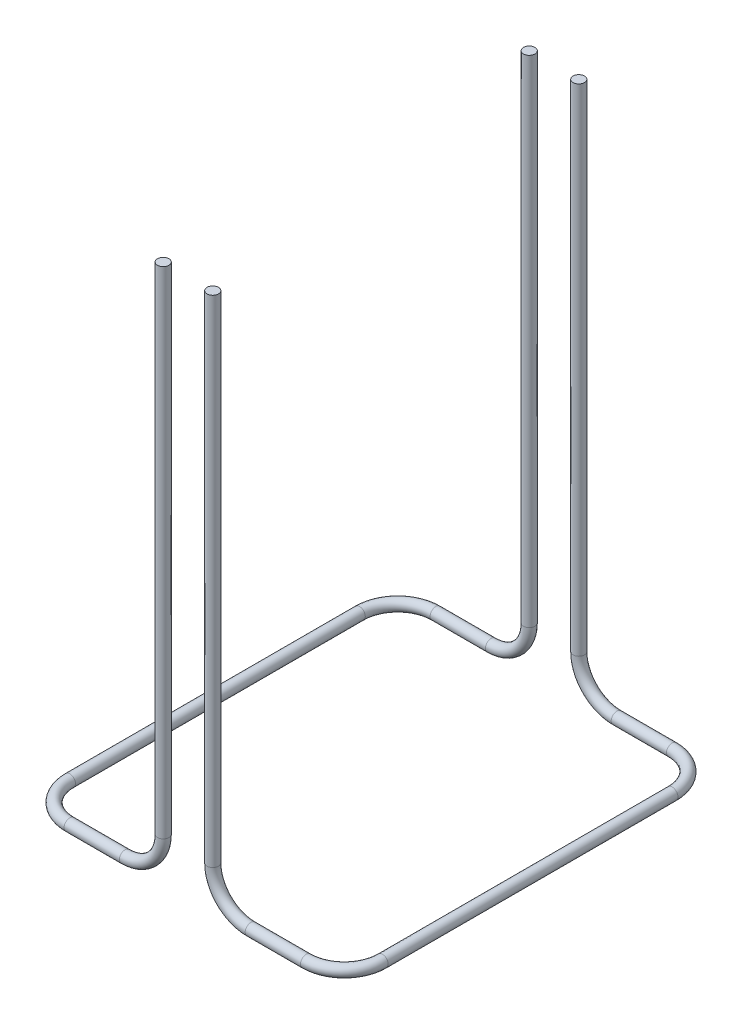
ISO-10303-21;
HEADER;
FILE_DESCRIPTION(('STEP AP214'),'2;1');
FILE_NAME('part.step','',(''),(''),'','','');
FILE_SCHEMA(('AUTOMOTIVE_DESIGN { 1 0 10303 214 1 1 1 1 }'));
ENDSEC;
DATA;
#1=APPLICATION_CONTEXT('core data for automotive mechanical design processes');
#2=APPLICATION_PROTOCOL_DEFINITION('international standard','automotive_design',2000,#1);
#3=PRODUCT_CONTEXT('',#1,'mechanical');
#4=PRODUCT('Part','Part','',(#3));
#5=PRODUCT_RELATED_PRODUCT_CATEGORY('part','',(#4));
#6=PRODUCT_DEFINITION_FORMATION('','',#4);
#7=PRODUCT_DEFINITION_CONTEXT('part definition',#1,'design');
#8=PRODUCT_DEFINITION('design','',#6,#7);
#9=PRODUCT_DEFINITION_SHAPE('','',#8);
#10=(LENGTH_UNIT() NAMED_UNIT(*) SI_UNIT(.MILLI.,.METRE.));
#11=(NAMED_UNIT(*) PLANE_ANGLE_UNIT() SI_UNIT($,.RADIAN.));
#12=(NAMED_UNIT(*) SI_UNIT($,.STERADIAN.) SOLID_ANGLE_UNIT());
#13=UNCERTAINTY_MEASURE_WITH_UNIT(LENGTH_MEASURE(1.E-05),#10,'distance_accuracy_value','');
#14=(GEOMETRIC_REPRESENTATION_CONTEXT(3) GLOBAL_UNCERTAINTY_ASSIGNED_CONTEXT((#13)) GLOBAL_UNIT_ASSIGNED_CONTEXT((#10,
#11,#12)) REPRESENTATION_CONTEXT('',''));
#15=CARTESIAN_POINT('',(0.,0.,0.));
#16=DIRECTION('',(0.,0.,1.));
#17=DIRECTION('',(1.,0.,0.));
#18=AXIS2_PLACEMENT_3D('',#15,#16,#17);
#19=CARTESIAN_POINT('',(-32.4951163129181,700.563396671916,0.));
#20=DIRECTION('',(0.,1.,0.));
#21=DIRECTION('',(1.,0.,0.));
#22=AXIS2_PLACEMENT_3D('',#19,#20,#21);
#23=PLANE('',#22);
#24=CARTESIAN_POINT('',(-32.4951163129181,700.563396671916,0.));
#25=DIRECTION('',(0.,1.,0.));
#26=DIRECTION('',(1.,0.,0.));
#27=AXIS2_PLACEMENT_3D('',#24,#25,#26);
#28=CIRCLE('',#27,7.5);
#29=CARTESIAN_POINT('',(-24.9951163129181,700.563396671916,0.));
#30=VERTEX_POINT('',#29);
#31=EDGE_CURVE('E99',#30,#30,#28,.T.);
#32=ORIENTED_EDGE('',*,*,#31,.T.);
#33=EDGE_LOOP('',(#32));
#34=FACE_BOUND('',#33,.T.);
#35=ADVANCED_FACE('F65',(#34),#23,.T.);
#36=CARTESIAN_POINT('',(-32.4951163129181,700.563396671916,-480.));
#37=DIRECTION('',(0.,-1.,0.));
#38=DIRECTION('',(1.,0.,0.));
#39=AXIS2_PLACEMENT_3D('',#36,#37,#38);
#40=PLANE('',#39);
#41=CARTESIAN_POINT('',(-32.4951163129181,700.563396671916,-480.));
#42=DIRECTION('',(0.,-1.,0.));
#43=DIRECTION('',(1.,0.,0.));
#44=AXIS2_PLACEMENT_3D('',#41,#42,#43);
#45=CIRCLE('',#44,7.5);
#46=CARTESIAN_POINT('',(-24.9951163129181,700.563396671916,-480.));
#47=VERTEX_POINT('',#46);
#48=EDGE_CURVE('E12',#47,#47,#45,.T.);
#49=ORIENTED_EDGE('',*,*,#48,.F.);
#50=EDGE_LOOP('',(#49));
#51=FACE_BOUND('',#50,.T.);
#52=ADVANCED_FACE('F107',(#51),#40,.F.);
#53=CARTESIAN_POINT('',(-32.4951163129181,700.563396671916,0.));
#54=DIRECTION('',(0.,-1.,0.));
#55=DIRECTION('',(0.,0.,-1.));
#56=AXIS2_PLACEMENT_3D('',#53,#54,#55);
#57=CYLINDRICAL_SURFACE('',#56,7.5);
#58=CARTESIAN_POINT('',(-32.4951163129181,50.5633966719165,0.));
#59=DIRECTION('',(0.,1.,0.));
#60=DIRECTION('',(1.,0.,0.));
#61=AXIS2_PLACEMENT_3D('',#58,#59,#60);
#62=CIRCLE('',#61,7.5);
#63=CARTESIAN_POINT('',(-24.9951163129181,50.5633966719165,0.));
#64=VERTEX_POINT('',#63);
#65=EDGE_CURVE('E96',#64,#64,#62,.T.);
#66=ORIENTED_EDGE('',*,*,#65,.T.);
#67=EDGE_LOOP('',(#66));
#68=FACE_BOUND('',#67,.T.);
#69=ORIENTED_EDGE('',*,*,#31,.F.);
#70=EDGE_LOOP('',(#69));
#71=FACE_BOUND('',#70,.T.);
#72=ADVANCED_FACE('F104',(#68,#71),#57,.T.);
#73=CARTESIAN_POINT('',(-82.4951163129181,50.5633966719165,0.));
#74=DIRECTION('',(0.,0.,-1.));
#75=DIRECTION('',(-1.,0.,0.));
#76=AXIS2_PLACEMENT_3D('',#73,#74,#75);
#77=TOROIDAL_SURFACE('',#76,50.,7.5);
#78=CARTESIAN_POINT('',(-82.4951163129181,0.563396671916461,0.));
#79=DIRECTION('',(1.,0.,0.));
#80=DIRECTION('',(0.,-1.,0.));
#81=AXIS2_PLACEMENT_3D('',#78,#79,#80);
#82=CIRCLE('',#81,7.5);
#83=CARTESIAN_POINT('',(-82.4951163129181,-6.93660332808354,0.));
#84=VERTEX_POINT('',#83);
#85=EDGE_CURVE('E93',#84,#84,#82,.T.);
#86=CARTESIAN_POINT('',(-82.4951163129181,50.5633966719165,0.));
#87=DIRECTION('',(0.,0.,-1.));
#88=DIRECTION('',(-1.,0.,0.));
#89=AXIS2_PLACEMENT_3D('',#86,#87,#88);
#90=CIRCLE('',#89,57.5);
#91=EDGE_CURVE('',#64,#84,#90,.T.);
#92=ORIENTED_EDGE('',*,*,#65,.F.);
#93=ORIENTED_EDGE('',*,*,#85,.T.);
#94=ORIENTED_EDGE('',*,*,#91,.T.);
#95=ORIENTED_EDGE('',*,*,#91,.F.);
#96=EDGE_LOOP('',(#92,#94,#93,#95));
#97=FACE_BOUND('',#96,.T.);
#98=ADVANCED_FACE('F106',(#97),#77,.T.);
#99=CARTESIAN_POINT('',(-82.4951163129181,0.563396671916454,0.));
#100=DIRECTION('',(-1.,0.,0.));
#101=DIRECTION('',(0.,0.,1.));
#102=AXIS2_PLACEMENT_3D('',#99,#100,#101);
#103=CYLINDRICAL_SURFACE('',#102,7.5);
#104=CARTESIAN_POINT('',(-154.999225813636,0.563396671916454,0.));
#105=DIRECTION('',(1.,0.,0.));
#106=DIRECTION('',(0.,-1.,0.));
#107=AXIS2_PLACEMENT_3D('',#104,#105,#106);
#108=CIRCLE('',#107,7.5);
#109=CARTESIAN_POINT('',(-154.999225813636,0.563396671916455,7.5));
#110=VERTEX_POINT('',#109);
#111=EDGE_CURVE('E90',#110,#110,#108,.T.);
#112=ORIENTED_EDGE('',*,*,#111,.T.);
#113=EDGE_LOOP('',(#112));
#114=FACE_BOUND('',#113,.T.);
#115=ORIENTED_EDGE('',*,*,#85,.F.);
#116=EDGE_LOOP('',(#115));
#117=FACE_BOUND('',#116,.T.);
#118=ADVANCED_FACE('F114',(#114,#117),#103,.T.);
#119=CARTESIAN_POINT('',(-154.999225813636,0.563396671916447,-50.));
#120=DIRECTION('',(0.,-1.,0.));
#121=DIRECTION('',(0.,0.,-1.));
#122=AXIS2_PLACEMENT_3D('',#119,#120,#121);
#123=TOROIDAL_SURFACE('',#122,50.,7.5);
#124=CARTESIAN_POINT('',(-204.999225813636,0.563396671916447,-50.));
#125=DIRECTION('',(0.,0.,1.));
#126=DIRECTION('',(0.,-1.,0.));
#127=AXIS2_PLACEMENT_3D('',#124,#125,#126);
#128=CIRCLE('',#127,7.5);
#129=CARTESIAN_POINT('',(-212.499225813636,0.563396671916447,-50.));
#130=VERTEX_POINT('',#129);
#131=EDGE_CURVE('E87',#130,#130,#128,.T.);
#132=CARTESIAN_POINT('',(-154.999225813636,0.563396671916447,-50.));
#133=DIRECTION('',(0.,-1.,0.));
#134=DIRECTION('',(0.,0.,-1.));
#135=AXIS2_PLACEMENT_3D('',#132,#133,#134);
#136=CIRCLE('',#135,57.5);
#137=EDGE_CURVE('',#110,#130,#136,.T.);
#138=ORIENTED_EDGE('',*,*,#111,.F.);
#139=ORIENTED_EDGE('',*,*,#131,.T.);
#140=ORIENTED_EDGE('',*,*,#137,.T.);
#141=ORIENTED_EDGE('',*,*,#137,.F.);
#142=EDGE_LOOP('',(#138,#140,#139,#141));
#143=FACE_BOUND('',#142,.T.);
#144=ADVANCED_FACE('F139',(#143),#123,.T.);
#145=CARTESIAN_POINT('',(-204.999225813636,0.563396671916461,-50.));
#146=DIRECTION('',(0.,0.,-1.));
#147=DIRECTION('',(0.,1.,0.));
#148=AXIS2_PLACEMENT_3D('',#145,#146,#147);
#149=CYLINDRICAL_SURFACE('',#148,7.5);
#150=CARTESIAN_POINT('',(-204.999225813636,0.563396671916509,-430.));
#151=DIRECTION('',(0.,0.,1.));
#152=DIRECTION('',(0.,-1.,0.));
#153=AXIS2_PLACEMENT_3D('',#150,#151,#152);
#154=CIRCLE('',#153,7.5);
#155=CARTESIAN_POINT('',(-212.499225813636,0.563396671916518,-430.));
#156=VERTEX_POINT('',#155);
#157=EDGE_CURVE('E84',#156,#156,#154,.T.);
#158=ORIENTED_EDGE('',*,*,#157,.T.);
#159=EDGE_LOOP('',(#158));
#160=FACE_BOUND('',#159,.T.);
#161=ORIENTED_EDGE('',*,*,#131,.F.);
#162=EDGE_LOOP('',(#161));
#163=FACE_BOUND('',#162,.T.);
#164=ADVANCED_FACE('F135',(#160,#163),#149,.T.);
#165=CARTESIAN_POINT('',(-154.999225813636,0.563396671916454,-430.));
#166=DIRECTION('',(0.,-1.,0.));
#167=DIRECTION('',(1.,0.,0.));
#168=AXIS2_PLACEMENT_3D('',#165,#166,#167);
#169=TOROIDAL_SURFACE('',#168,50.,7.5);
#170=CARTESIAN_POINT('',(-154.999225813636,0.563396671916454,-480.));
#171=DIRECTION('',(-1.,0.,0.));
#172=DIRECTION('',(0.,-1.,0.));
#173=AXIS2_PLACEMENT_3D('',#170,#171,#172);
#174=CIRCLE('',#173,7.5);
#175=CARTESIAN_POINT('',(-154.999225813636,0.563396671916454,-487.5));
#176=VERTEX_POINT('',#175);
#177=EDGE_CURVE('E79',#176,#176,#174,.T.);
#178=CARTESIAN_POINT('',(-154.999225813636,0.563396671916454,-430.));
#179=DIRECTION('',(0.,-1.,0.));
#180=DIRECTION('',(1.,0.,0.));
#181=AXIS2_PLACEMENT_3D('',#178,#179,#180);
#182=CIRCLE('',#181,57.5);
#183=EDGE_CURVE('',#156,#176,#182,.T.);
#184=ORIENTED_EDGE('',*,*,#157,.F.);
#185=ORIENTED_EDGE('',*,*,#177,.T.);
#186=ORIENTED_EDGE('',*,*,#183,.T.);
#187=ORIENTED_EDGE('',*,*,#183,.F.);
#188=EDGE_LOOP('',(#184,#186,#185,#187));
#189=FACE_BOUND('',#188,.T.);
#190=ADVANCED_FACE('F131',(#189),#169,.T.);
#191=CARTESIAN_POINT('',(-154.999225813636,0.563396671916468,-480.));
#192=DIRECTION('',(1.,0.,0.));
#193=DIRECTION('',(0.,1.,0.));
#194=AXIS2_PLACEMENT_3D('',#191,#192,#193);
#195=CYLINDRICAL_SURFACE('',#194,7.5);
#196=CARTESIAN_POINT('',(-82.4951163129181,0.563396671916405,-480.));
#197=DIRECTION('',(-1.,0.,0.));
#198=DIRECTION('',(0.,-1.,0.));
#199=AXIS2_PLACEMENT_3D('',#196,#197,#198);
#200=CIRCLE('',#199,7.5);
#201=CARTESIAN_POINT('',(-82.4951163129181,-6.93660332808359,-480.));
#202=VERTEX_POINT('',#201);
#203=EDGE_CURVE('E75',#202,#202,#200,.T.);
#204=ORIENTED_EDGE('',*,*,#203,.T.);
#205=EDGE_LOOP('',(#204));
#206=FACE_BOUND('',#205,.T.);
#207=ORIENTED_EDGE('',*,*,#177,.F.);
#208=EDGE_LOOP('',(#207));
#209=FACE_BOUND('',#208,.T.);
#210=ADVANCED_FACE('F125',(#206,#209),#195,.T.);
#211=CARTESIAN_POINT('',(-82.495116312918,50.5633966719164,-480.));
#212=DIRECTION('',(0.,0.,1.));
#213=DIRECTION('',(1.,0.,0.));
#214=AXIS2_PLACEMENT_3D('',#211,#212,#213);
#215=TOROIDAL_SURFACE('',#214,50.,7.5);
#216=CARTESIAN_POINT('',(-32.4951163129182,50.5633966719165,-480.));
#217=DIRECTION('',(0.,-1.,0.));
#218=DIRECTION('',(1.,0.,0.));
#219=AXIS2_PLACEMENT_3D('',#216,#217,#218);
#220=CIRCLE('',#219,7.5);
#221=CARTESIAN_POINT('',(-24.995116312918,50.5633966719165,-480.));
#222=VERTEX_POINT('',#221);
#223=EDGE_CURVE('E71',#222,#222,#220,.T.);
#224=CARTESIAN_POINT('',(-82.495116312918,50.5633966719164,-480.));
#225=DIRECTION('',(0.,0.,1.));
#226=DIRECTION('',(1.,0.,0.));
#227=AXIS2_PLACEMENT_3D('',#224,#225,#226);
#228=CIRCLE('',#227,57.5);
#229=EDGE_CURVE('',#202,#222,#228,.T.);
#230=ORIENTED_EDGE('',*,*,#203,.F.);
#231=ORIENTED_EDGE('',*,*,#223,.T.);
#232=ORIENTED_EDGE('',*,*,#229,.T.);
#233=ORIENTED_EDGE('',*,*,#229,.F.);
#234=EDGE_LOOP('',(#230,#232,#231,#233));
#235=FACE_BOUND('',#234,.T.);
#236=ADVANCED_FACE('F120',(#235),#215,.T.);
#237=CARTESIAN_POINT('',(-32.495116312918,50.5633966719165,-480.));
#238=DIRECTION('',(0.,1.,0.));
#239=DIRECTION('',(-1.,0.,0.));
#240=AXIS2_PLACEMENT_3D('',#237,#238,#239);
#241=CYLINDRICAL_SURFACE('',#240,7.5);
#242=ORIENTED_EDGE('',*,*,#48,.T.);
#243=EDGE_LOOP('',(#242));
#244=FACE_BOUND('',#243,.T.);
#245=ORIENTED_EDGE('',*,*,#223,.F.);
#246=EDGE_LOOP('',(#245));
#247=FACE_BOUND('',#246,.T.);
#248=ADVANCED_FACE('F118',(#244,#247),#241,.T.);
#249=CLOSED_SHELL('',(#35,#52,#72,#98,#118,#144,#164,#190,#210,#236,#248));
#250=MANIFOLD_SOLID_BREP('B2',#249);
#251=CARTESIAN_POINT('',(32.4951163129181,700.563396671916,0.));
#252=DIRECTION('',(0.,1.,0.));
#253=DIRECTION('',(1.,0.,0.));
#254=AXIS2_PLACEMENT_3D('',#251,#252,#253);
#255=PLANE('',#254);
#256=CARTESIAN_POINT('',(32.4951163129181,700.563396671916,0.));
#257=DIRECTION('',(0.,1.,0.));
#258=DIRECTION('',(1.,0.,0.));
#259=AXIS2_PLACEMENT_3D('',#256,#257,#258);
#260=CIRCLE('',#259,7.5);
#261=CARTESIAN_POINT('',(39.9951163129181,700.563396671916,0.));
#262=VERTEX_POINT('',#261);
#263=EDGE_CURVE('E260',#262,#262,#260,.T.);
#264=ORIENTED_EDGE('',*,*,#263,.T.);
#265=EDGE_LOOP('',(#264));
#266=FACE_BOUND('',#265,.T.);
#267=ADVANCED_FACE('F226',(#266),#255,.T.);
#268=CARTESIAN_POINT('',(32.4951163129181,700.563396671916,-480.));
#269=DIRECTION('',(0.,-1.,0.));
#270=DIRECTION('',(1.,0.,0.));
#271=AXIS2_PLACEMENT_3D('',#268,#269,#270);
#272=PLANE('',#271);
#273=CARTESIAN_POINT('',(32.4951163129181,700.563396671916,-480.));
#274=DIRECTION('',(0.,-1.,0.));
#275=DIRECTION('',(1.,0.,0.));
#276=AXIS2_PLACEMENT_3D('',#273,#274,#275);
#277=CIRCLE('',#276,7.5);
#278=CARTESIAN_POINT('',(39.9951163129181,700.563396671916,-480.));
#279=VERTEX_POINT('',#278);
#280=EDGE_CURVE('E64',#279,#279,#277,.T.);
#281=ORIENTED_EDGE('',*,*,#280,.F.);
#282=EDGE_LOOP('',(#281));
#283=FACE_BOUND('',#282,.T.);
#284=ADVANCED_FACE('F268',(#283),#272,.F.);
#285=CARTESIAN_POINT('',(32.4951163129181,700.563396671916,0.));
#286=DIRECTION('',(0.,-1.,0.));
#287=DIRECTION('',(0.,0.,-1.));
#288=AXIS2_PLACEMENT_3D('',#285,#286,#287);
#289=CYLINDRICAL_SURFACE('',#288,7.5);
#290=CARTESIAN_POINT('',(32.4951163129181,50.5633966719165,0.));
#291=DIRECTION('',(0.,1.,0.));
#292=DIRECTION('',(1.,0.,0.));
#293=AXIS2_PLACEMENT_3D('',#290,#291,#292);
#294=CIRCLE('',#293,7.5);
#295=CARTESIAN_POINT('',(24.9951163129181,50.5633966719165,0.));
#296=VERTEX_POINT('',#295);
#297=EDGE_CURVE('E257',#296,#296,#294,.T.);
#298=ORIENTED_EDGE('',*,*,#297,.T.);
#299=EDGE_LOOP('',(#298));
#300=FACE_BOUND('',#299,.T.);
#301=ORIENTED_EDGE('',*,*,#263,.F.);
#302=EDGE_LOOP('',(#301));
#303=FACE_BOUND('',#302,.T.);
#304=ADVANCED_FACE('F265',(#300,#303),#289,.T.);
#305=CARTESIAN_POINT('',(82.4951163129181,50.5633966719165,0.));
#306=DIRECTION('',(0.,0.,1.));
#307=DIRECTION('',(1.,0.,0.));
#308=AXIS2_PLACEMENT_3D('',#305,#306,#307);
#309=TOROIDAL_SURFACE('',#308,50.,7.5);
#310=CARTESIAN_POINT('',(82.4951163129181,0.563396671916461,0.));
#311=DIRECTION('',(-1.,0.,0.));
#312=DIRECTION('',(0.,1.,0.));
#313=AXIS2_PLACEMENT_3D('',#310,#311,#312);
#314=CIRCLE('',#313,7.5);
#315=CARTESIAN_POINT('',(82.4951163129181,-6.93660332808354,0.));
#316=VERTEX_POINT('',#315);
#317=EDGE_CURVE('E254',#316,#316,#314,.T.);
#318=CARTESIAN_POINT('',(82.4951163129181,50.5633966719165,0.));
#319=DIRECTION('',(0.,0.,1.));
#320=DIRECTION('',(1.,0.,0.));
#321=AXIS2_PLACEMENT_3D('',#318,#319,#320);
#322=CIRCLE('',#321,57.5);
#323=EDGE_CURVE('',#296,#316,#322,.T.);
#324=ORIENTED_EDGE('',*,*,#297,.F.);
#325=ORIENTED_EDGE('',*,*,#317,.T.);
#326=ORIENTED_EDGE('',*,*,#323,.T.);
#327=ORIENTED_EDGE('',*,*,#323,.F.);
#328=EDGE_LOOP('',(#324,#326,#325,#327));
#329=FACE_BOUND('',#328,.T.);
#330=ADVANCED_FACE('F267',(#329),#309,.T.);
#331=CARTESIAN_POINT('',(82.4951163129181,0.563396671916454,0.));
#332=DIRECTION('',(1.,0.,0.));
#333=DIRECTION('',(0.,0.,-1.));
#334=AXIS2_PLACEMENT_3D('',#331,#332,#333);
#335=CYLINDRICAL_SURFACE('',#334,7.5);
#336=CARTESIAN_POINT('',(154.999225813636,0.563396671916454,0.));
#337=DIRECTION('',(-1.,0.,0.));
#338=DIRECTION('',(0.,1.,0.));
#339=AXIS2_PLACEMENT_3D('',#336,#337,#338);
#340=CIRCLE('',#339,7.5);
#341=CARTESIAN_POINT('',(154.999225813636,0.563396671916455,7.5));
#342=VERTEX_POINT('',#341);
#343=EDGE_CURVE('E251',#342,#342,#340,.T.);
#344=ORIENTED_EDGE('',*,*,#343,.T.);
#345=EDGE_LOOP('',(#344));
#346=FACE_BOUND('',#345,.T.);
#347=ORIENTED_EDGE('',*,*,#317,.F.);
#348=EDGE_LOOP('',(#347));
#349=FACE_BOUND('',#348,.T.);
#350=ADVANCED_FACE('F275',(#346,#349),#335,.T.);
#351=CARTESIAN_POINT('',(154.999225813636,0.563396671916447,-50.));
#352=DIRECTION('',(0.,1.,0.));
#353=DIRECTION('',(0.,0.,1.));
#354=AXIS2_PLACEMENT_3D('',#351,#352,#353);
#355=TOROIDAL_SURFACE('',#354,50.,7.5);
#356=CARTESIAN_POINT('',(204.999225813636,0.563396671916447,-50.));
#357=DIRECTION('',(0.,0.,1.));
#358=DIRECTION('',(0.,1.,0.));
#359=AXIS2_PLACEMENT_3D('',#356,#357,#358);
#360=CIRCLE('',#359,7.5);
#361=CARTESIAN_POINT('',(212.499225813636,0.563396671916447,-50.));
#362=VERTEX_POINT('',#361);
#363=EDGE_CURVE('E248',#362,#362,#360,.T.);
#364=CARTESIAN_POINT('',(154.999225813636,0.563396671916447,-50.));
#365=DIRECTION('',(0.,1.,0.));
#366=DIRECTION('',(0.,0.,1.));
#367=AXIS2_PLACEMENT_3D('',#364,#365,#366);
#368=CIRCLE('',#367,57.5);
#369=EDGE_CURVE('',#342,#362,#368,.T.);
#370=ORIENTED_EDGE('',*,*,#343,.F.);
#371=ORIENTED_EDGE('',*,*,#363,.T.);
#372=ORIENTED_EDGE('',*,*,#369,.T.);
#373=ORIENTED_EDGE('',*,*,#369,.F.);
#374=EDGE_LOOP('',(#370,#372,#371,#373));
#375=FACE_BOUND('',#374,.T.);
#376=ADVANCED_FACE('F300',(#375),#355,.T.);
#377=CARTESIAN_POINT('',(204.999225813636,0.563396671916461,-50.));
#378=DIRECTION('',(0.,0.,-1.));
#379=DIRECTION('',(0.,1.,0.));
#380=AXIS2_PLACEMENT_3D('',#377,#378,#379);
#381=CYLINDRICAL_SURFACE('',#380,7.5);
#382=CARTESIAN_POINT('',(204.999225813636,0.563396671916509,-430.));
#383=DIRECTION('',(0.,0.,1.));
#384=DIRECTION('',(0.,1.,0.));
#385=AXIS2_PLACEMENT_3D('',#382,#383,#384);
#386=CIRCLE('',#385,7.5);
#387=CARTESIAN_POINT('',(212.499225813636,0.563396671916518,-430.));
#388=VERTEX_POINT('',#387);
#389=EDGE_CURVE('E245',#388,#388,#386,.T.);
#390=ORIENTED_EDGE('',*,*,#389,.T.);
#391=EDGE_LOOP('',(#390));
#392=FACE_BOUND('',#391,.T.);
#393=ORIENTED_EDGE('',*,*,#363,.F.);
#394=EDGE_LOOP('',(#393));
#395=FACE_BOUND('',#394,.T.);
#396=ADVANCED_FACE('F296',(#392,#395),#381,.T.);
#397=CARTESIAN_POINT('',(154.999225813636,0.563396671916454,-430.));
#398=DIRECTION('',(0.,1.,0.));
#399=DIRECTION('',(-1.,0.,0.));
#400=AXIS2_PLACEMENT_3D('',#397,#398,#399);
#401=TOROIDAL_SURFACE('',#400,50.,7.5);
#402=CARTESIAN_POINT('',(154.999225813636,0.563396671916454,-480.));
#403=DIRECTION('',(1.,0.,0.));
#404=DIRECTION('',(0.,1.,0.));
#405=AXIS2_PLACEMENT_3D('',#402,#403,#404);
#406=CIRCLE('',#405,7.5);
#407=CARTESIAN_POINT('',(154.999225813636,0.563396671916454,-487.5));
#408=VERTEX_POINT('',#407);
#409=EDGE_CURVE('E240',#408,#408,#406,.T.);
#410=CARTESIAN_POINT('',(154.999225813636,0.563396671916454,-430.));
#411=DIRECTION('',(0.,1.,0.));
#412=DIRECTION('',(-1.,0.,0.));
#413=AXIS2_PLACEMENT_3D('',#410,#411,#412);
#414=CIRCLE('',#413,57.5);
#415=EDGE_CURVE('',#388,#408,#414,.T.);
#416=ORIENTED_EDGE('',*,*,#389,.F.);
#417=ORIENTED_EDGE('',*,*,#409,.T.);
#418=ORIENTED_EDGE('',*,*,#415,.T.);
#419=ORIENTED_EDGE('',*,*,#415,.F.);
#420=EDGE_LOOP('',(#416,#418,#417,#419));
#421=FACE_BOUND('',#420,.T.);
#422=ADVANCED_FACE('F292',(#421),#401,.T.);
#423=CARTESIAN_POINT('',(154.999225813636,0.563396671916468,-480.));
#424=DIRECTION('',(-1.,0.,0.));
#425=DIRECTION('',(0.,-1.,0.));
#426=AXIS2_PLACEMENT_3D('',#423,#424,#425);
#427=CYLINDRICAL_SURFACE('',#426,7.5);
#428=CARTESIAN_POINT('',(82.4951163129181,0.563396671916405,-480.));
#429=DIRECTION('',(1.,0.,0.));
#430=DIRECTION('',(0.,1.,0.));
#431=AXIS2_PLACEMENT_3D('',#428,#429,#430);
#432=CIRCLE('',#431,7.5);
#433=CARTESIAN_POINT('',(82.4951163129181,-6.93660332808359,-480.));
#434=VERTEX_POINT('',#433);
#435=EDGE_CURVE('E236',#434,#434,#432,.T.);
#436=ORIENTED_EDGE('',*,*,#435,.T.);
#437=EDGE_LOOP('',(#436));
#438=FACE_BOUND('',#437,.T.);
#439=ORIENTED_EDGE('',*,*,#409,.F.);
#440=EDGE_LOOP('',(#439));
#441=FACE_BOUND('',#440,.T.);
#442=ADVANCED_FACE('F286',(#438,#441),#427,.T.);
#443=CARTESIAN_POINT('',(82.495116312918,50.5633966719164,-480.));
#444=DIRECTION('',(0.,0.,-1.));
#445=DIRECTION('',(-1.,0.,0.));
#446=AXIS2_PLACEMENT_3D('',#443,#444,#445);
#447=TOROIDAL_SURFACE('',#446,50.,7.5);
#448=CARTESIAN_POINT('',(32.4951163129181,50.5633966719165,-480.));
#449=DIRECTION('',(0.,-1.,0.));
#450=DIRECTION('',(1.,0.,0.));
#451=AXIS2_PLACEMENT_3D('',#448,#449,#450);
#452=CIRCLE('',#451,7.5);
#453=CARTESIAN_POINT('',(24.995116312918,50.5633966719165,-480.));
#454=VERTEX_POINT('',#453);
#455=EDGE_CURVE('E232',#454,#454,#452,.T.);
#456=CARTESIAN_POINT('',(82.495116312918,50.5633966719164,-480.));
#457=DIRECTION('',(0.,0.,-1.));
#458=DIRECTION('',(-1.,0.,0.));
#459=AXIS2_PLACEMENT_3D('',#456,#457,#458);
#460=CIRCLE('',#459,57.5);
#461=EDGE_CURVE('',#434,#454,#460,.T.);
#462=ORIENTED_EDGE('',*,*,#435,.F.);
#463=ORIENTED_EDGE('',*,*,#455,.T.);
#464=ORIENTED_EDGE('',*,*,#461,.T.);
#465=ORIENTED_EDGE('',*,*,#461,.F.);
#466=EDGE_LOOP('',(#462,#464,#463,#465));
#467=FACE_BOUND('',#466,.T.);
#468=ADVANCED_FACE('F281',(#467),#447,.T.);
#469=CARTESIAN_POINT('',(32.495116312918,50.5633966719165,-480.));
#470=DIRECTION('',(0.,1.,0.));
#471=DIRECTION('',(-1.,0.,0.));
#472=AXIS2_PLACEMENT_3D('',#469,#470,#471);
#473=CYLINDRICAL_SURFACE('',#472,7.5);
#474=ORIENTED_EDGE('',*,*,#280,.T.);
#475=EDGE_LOOP('',(#474));
#476=FACE_BOUND('',#475,.T.);
#477=ORIENTED_EDGE('',*,*,#455,.F.);
#478=EDGE_LOOP('',(#477));
#479=FACE_BOUND('',#478,.T.);
#480=ADVANCED_FACE('F279',(#476,#479),#473,.T.);
#481=CLOSED_SHELL('',(#267,#284,#304,#330,#350,#376,#396,#422,#442,#468,#480));
#482=MANIFOLD_SOLID_BREP('B7',#481);
#483=ADVANCED_BREP_SHAPE_REPRESENTATION('',(#18,#250,#482),#14);
#484=SHAPE_DEFINITION_REPRESENTATION(#9,#483);
ENDSEC;
END-ISO-10303-21;
